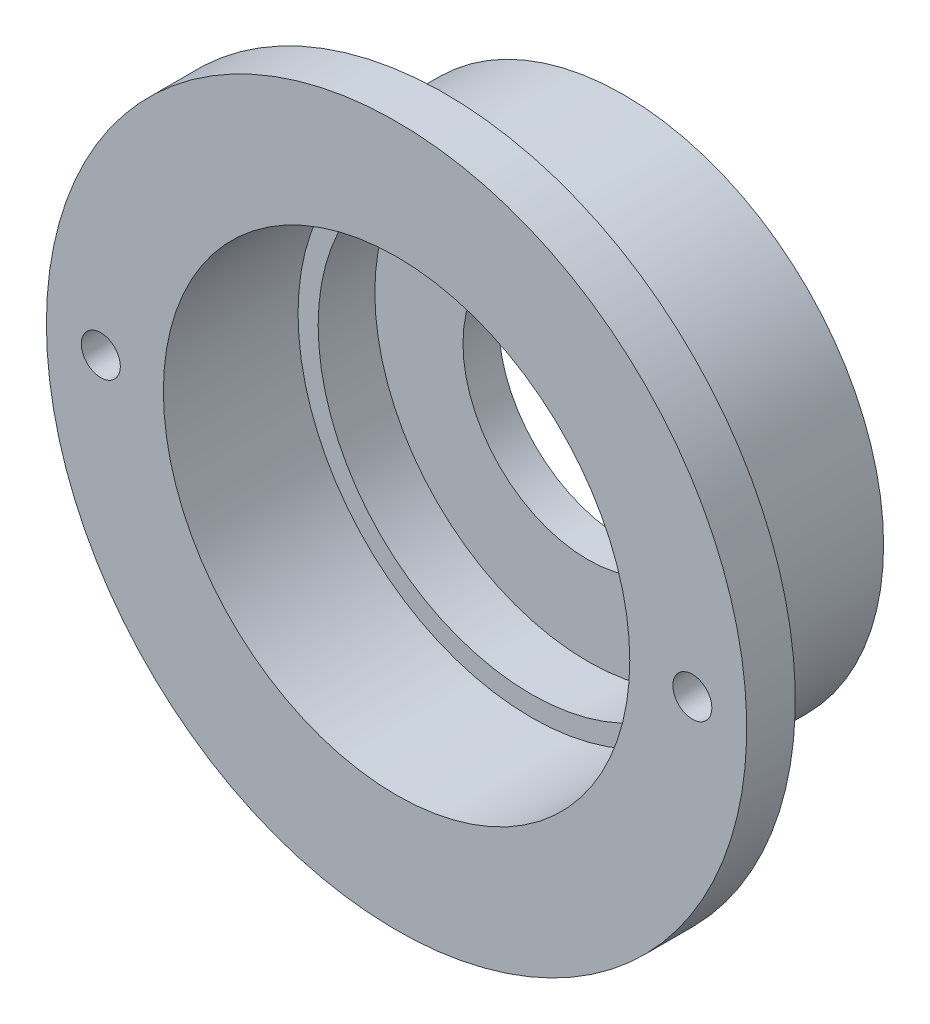
ISO-10303-21;
HEADER;
FILE_DESCRIPTION(('STEP AP214'),'2;1');
FILE_NAME('part.step','',(''),(''),'','','');
FILE_SCHEMA(('AUTOMOTIVE_DESIGN { 1 0 10303 214 1 1 1 1 }'));
ENDSEC;
DATA;
#1=APPLICATION_CONTEXT('core data for automotive mechanical design processes');
#2=APPLICATION_PROTOCOL_DEFINITION('international standard','automotive_design',2000,#1);
#3=PRODUCT_CONTEXT('',#1,'mechanical');
#4=PRODUCT('Part','Part','',(#3));
#5=PRODUCT_RELATED_PRODUCT_CATEGORY('part','',(#4));
#6=PRODUCT_DEFINITION_FORMATION('','',#4);
#7=PRODUCT_DEFINITION_CONTEXT('part definition',#1,'design');
#8=PRODUCT_DEFINITION('design','',#6,#7);
#9=PRODUCT_DEFINITION_SHAPE('','',#8);
#10=(LENGTH_UNIT() NAMED_UNIT(*) SI_UNIT(.MILLI.,.METRE.));
#11=(NAMED_UNIT(*) PLANE_ANGLE_UNIT() SI_UNIT($,.RADIAN.));
#12=(NAMED_UNIT(*) SI_UNIT($,.STERADIAN.) SOLID_ANGLE_UNIT());
#13=UNCERTAINTY_MEASURE_WITH_UNIT(LENGTH_MEASURE(1.E-05),#10,'distance_accuracy_value','');
#14=(GEOMETRIC_REPRESENTATION_CONTEXT(3) GLOBAL_UNCERTAINTY_ASSIGNED_CONTEXT((#13)) GLOBAL_UNIT_ASSIGNED_CONTEXT((#10,
#11,#12)) REPRESENTATION_CONTEXT('',''));
#15=CARTESIAN_POINT('',(0.,0.,0.));
#16=DIRECTION('',(0.,0.,1.));
#17=DIRECTION('',(1.,0.,0.));
#18=AXIS2_PLACEMENT_3D('',#15,#16,#17);
#19=CARTESIAN_POINT('',(0.,0.,-4.70047346479343));
#20=DIRECTION('',(0.,0.,-1.));
#21=DIRECTION('',(-1.,0.,0.));
#22=AXIS2_PLACEMENT_3D('',#19,#20,#21);
#23=PLANE('',#22);
#24=CARTESIAN_POINT('',(0.,0.,-4.70047346479343));
#25=DIRECTION('',(0.,0.,-1.));
#26=DIRECTION('',(-1.,0.,0.));
#27=AXIS2_PLACEMENT_3D('',#24,#25,#26);
#28=CIRCLE('',#27,7.);
#29=CARTESIAN_POINT('',(-7.,0.,-4.70047346479343));
#30=VERTEX_POINT('',#29);
#31=EDGE_CURVE('E59',#30,#30,#28,.T.);
#32=ORIENTED_EDGE('',*,*,#31,.F.);
#33=EDGE_LOOP('',(#32));
#34=FACE_BOUND('',#33,.T.);
#35=CARTESIAN_POINT('',(0.,0.,-4.70047346479343));
#36=DIRECTION('',(0.,0.,-1.));
#37=DIRECTION('',(-1.,0.,0.));
#38=AXIS2_PLACEMENT_3D('',#35,#36,#37);
#39=CIRCLE('',#38,14.565);
#40=CARTESIAN_POINT('',(-14.565,0.,-4.70047346479343));
#41=VERTEX_POINT('',#40);
#42=EDGE_CURVE('E62',#41,#41,#39,.T.);
#43=ORIENTED_EDGE('',*,*,#42,.T.);
#44=EDGE_LOOP('',(#43));
#45=FACE_BOUND('',#44,.T.);
#46=ADVANCED_FACE('F34',(#34,#45),#23,.T.);
#47=CARTESIAN_POINT('',(0.,0.,-25.4112856059014));
#48=DIRECTION('',(0.,0.,-1.));
#49=DIRECTION('',(-1.,0.,0.));
#50=AXIS2_PLACEMENT_3D('',#47,#48,#49);
#51=CYLINDRICAL_SURFACE('',#50,19.6178195017485);
#52=CARTESIAN_POINT('',(0.,0.,8.01952653520657));
#53=DIRECTION('',(0.,0.,-1.));
#54=DIRECTION('',(-1.,0.,0.));
#55=AXIS2_PLACEMENT_3D('',#52,#53,#54);
#56=CIRCLE('',#55,19.6178195017485);
#57=CARTESIAN_POINT('',(-19.6178195017485,0.,8.01952653520657));
#58=VERTEX_POINT('',#57);
#59=EDGE_CURVE('E10',#58,#58,#56,.T.);
#60=ORIENTED_EDGE('',*,*,#59,.T.);
#61=EDGE_LOOP('',(#60));
#62=FACE_BOUND('',#61,.T.);
#63=CARTESIAN_POINT('',(0.,0.,5.29952653520657));
#64=DIRECTION('',(0.,0.,-1.));
#65=DIRECTION('',(-1.,0.,0.));
#66=AXIS2_PLACEMENT_3D('',#63,#64,#65);
#67=CIRCLE('',#66,19.6178195017485);
#68=CARTESIAN_POINT('',(-19.6178195017485,0.,5.29952653520657));
#69=VERTEX_POINT('',#68);
#70=EDGE_CURVE('E37',#69,#69,#67,.F.);
#71=ORIENTED_EDGE('',*,*,#70,.T.);
#72=EDGE_LOOP('',(#71));
#73=FACE_BOUND('',#72,.T.);
#74=ADVANCED_FACE('F110',(#62,#73),#51,.T.);
#75=CARTESIAN_POINT('',(0.,0.,8.01952653520657));
#76=DIRECTION('',(0.,0.,-1.));
#77=DIRECTION('',(-1.,0.,0.));
#78=AXIS2_PLACEMENT_3D('',#75,#76,#77);
#79=PLANE('',#78);
#80=CARTESIAN_POINT('',(16.57,0.,8.01952653520657));
#81=DIRECTION('',(0.,0.,-1.));
#82=DIRECTION('',(1.,0.,0.));
#83=AXIS2_PLACEMENT_3D('',#80,#81,#82);
#84=CIRCLE('',#83,1.0922);
#85=CARTESIAN_POINT('',(17.6622,0.,8.01952653520657));
#86=VERTEX_POINT('',#85);
#87=EDGE_CURVE('E72',#86,#86,#84,.T.);
#88=ORIENTED_EDGE('',*,*,#87,.T.);
#89=EDGE_LOOP('',(#88));
#90=FACE_BOUND('',#89,.T.);
#91=CARTESIAN_POINT('',(-16.57,0.,8.01952653520657));
#92=DIRECTION('',(0.,0.,-1.));
#93=DIRECTION('',(-1.,0.,0.));
#94=AXIS2_PLACEMENT_3D('',#91,#92,#93);
#95=CIRCLE('',#94,1.0922);
#96=CARTESIAN_POINT('',(-17.6622,0.,8.01952653520657));
#97=VERTEX_POINT('',#96);
#98=EDGE_CURVE('E66',#97,#97,#95,.T.);
#99=ORIENTED_EDGE('',*,*,#98,.T.);
#100=EDGE_LOOP('',(#99));
#101=FACE_BOUND('',#100,.T.);
#102=ORIENTED_EDGE('',*,*,#59,.F.);
#103=EDGE_LOOP('',(#102));
#104=FACE_BOUND('',#103,.T.);
#105=CARTESIAN_POINT('',(0.,0.,8.01952653520657));
#106=DIRECTION('',(0.,0.,-1.));
#107=DIRECTION('',(-1.,0.,0.));
#108=AXIS2_PLACEMENT_3D('',#105,#106,#107);
#109=CIRCLE('',#108,13.0646195017485);
#110=CARTESIAN_POINT('',(-13.0646195017485,0.,8.01952653520657));
#111=VERTEX_POINT('',#110);
#112=EDGE_CURVE('E41',#111,#111,#109,.T.);
#113=ORIENTED_EDGE('',*,*,#112,.T.);
#114=EDGE_LOOP('',(#113));
#115=FACE_BOUND('',#114,.T.);
#116=ADVANCED_FACE('F81',(#90,#101,#104,#115),#79,.F.);
#117=CARTESIAN_POINT('',(0.,0.,-25.4112856059014));
#118=DIRECTION('',(0.,0.,-1.));
#119=DIRECTION('',(-1.,0.,0.));
#120=AXIS2_PLACEMENT_3D('',#117,#118,#119);
#121=CYLINDRICAL_SURFACE('',#120,13.0646195017485);
#122=ORIENTED_EDGE('',*,*,#112,.F.);
#123=EDGE_LOOP('',(#122));
#124=FACE_BOUND('',#123,.T.);
#125=CARTESIAN_POINT('',(0.,0.,0.474526535206573));
#126=DIRECTION('',(0.,0.,-1.));
#127=DIRECTION('',(-1.,0.,0.));
#128=AXIS2_PLACEMENT_3D('',#125,#126,#127);
#129=CIRCLE('',#128,13.0646195017485);
#130=CARTESIAN_POINT('',(-13.0646195017485,0.,0.474526535206573));
#131=VERTEX_POINT('',#130);
#132=EDGE_CURVE('E45',#131,#131,#129,.T.);
#133=ORIENTED_EDGE('',*,*,#132,.T.);
#134=EDGE_LOOP('',(#133));
#135=FACE_BOUND('',#134,.T.);
#136=ADVANCED_FACE('F135',(#124,#135),#121,.F.);
#137=CARTESIAN_POINT('',(0.,0.,0.474526535206571));
#138=DIRECTION('',(0.,0.,-1.));
#139=DIRECTION('',(-1.,0.,0.));
#140=AXIS2_PLACEMENT_3D('',#137,#138,#139);
#141=PLANE('',#140);
#142=ORIENTED_EDGE('',*,*,#132,.F.);
#143=EDGE_LOOP('',(#142));
#144=FACE_BOUND('',#143,.T.);
#145=CARTESIAN_POINT('',(0.,0.,0.474526535206573));
#146=DIRECTION('',(0.,0.,-1.));
#147=DIRECTION('',(-1.,0.,0.));
#148=AXIS2_PLACEMENT_3D('',#145,#146,#147);
#149=CIRCLE('',#148,11.938);
#150=CARTESIAN_POINT('',(-11.938,0.,0.474526535206573));
#151=VERTEX_POINT('',#150);
#152=EDGE_CURVE('E50',#151,#151,#149,.T.);
#153=ORIENTED_EDGE('',*,*,#152,.T.);
#154=EDGE_LOOP('',(#153));
#155=FACE_BOUND('',#154,.T.);
#156=ADVANCED_FACE('F131',(#144,#155),#141,.F.);
#157=CARTESIAN_POINT('',(0.,0.,-25.4112856059014));
#158=DIRECTION('',(0.,0.,-1.));
#159=DIRECTION('',(-1.,0.,0.));
#160=AXIS2_PLACEMENT_3D('',#157,#158,#159);
#161=CYLINDRICAL_SURFACE('',#160,11.938);
#162=ORIENTED_EDGE('',*,*,#152,.F.);
#163=EDGE_LOOP('',(#162));
#164=FACE_BOUND('',#163,.T.);
#165=CARTESIAN_POINT('',(0.,0.,-2.70047346479343));
#166=DIRECTION('',(0.,0.,-1.));
#167=DIRECTION('',(-1.,0.,0.));
#168=AXIS2_PLACEMENT_3D('',#165,#166,#167);
#169=CIRCLE('',#168,11.938);
#170=CARTESIAN_POINT('',(-11.938,0.,-2.70047346479343));
#171=VERTEX_POINT('',#170);
#172=EDGE_CURVE('E53',#171,#171,#169,.T.);
#173=ORIENTED_EDGE('',*,*,#172,.T.);
#174=EDGE_LOOP('',(#173));
#175=FACE_BOUND('',#174,.T.);
#176=ADVANCED_FACE('F124',(#164,#175),#161,.F.);
#177=CARTESIAN_POINT('',(0.,0.,-2.70047346479343));
#178=DIRECTION('',(0.,0.,-1.));
#179=DIRECTION('',(-1.,0.,0.));
#180=AXIS2_PLACEMENT_3D('',#177,#178,#179);
#181=PLANE('',#180);
#182=ORIENTED_EDGE('',*,*,#172,.F.);
#183=EDGE_LOOP('',(#182));
#184=FACE_BOUND('',#183,.T.);
#185=CARTESIAN_POINT('',(0.,0.,-2.70047346479343));
#186=DIRECTION('',(0.,0.,-1.));
#187=DIRECTION('',(-1.,0.,0.));
#188=AXIS2_PLACEMENT_3D('',#185,#186,#187);
#189=CIRCLE('',#188,7.);
#190=CARTESIAN_POINT('',(-7.,0.,-2.70047346479343));
#191=VERTEX_POINT('',#190);
#192=EDGE_CURVE('E56',#191,#191,#189,.T.);
#193=ORIENTED_EDGE('',*,*,#192,.T.);
#194=EDGE_LOOP('',(#193));
#195=FACE_BOUND('',#194,.T.);
#196=ADVANCED_FACE('F118',(#184,#195),#181,.F.);
#197=CARTESIAN_POINT('',(0.,0.,-25.4112856059014));
#198=DIRECTION('',(0.,0.,-1.));
#199=DIRECTION('',(-1.,0.,0.));
#200=AXIS2_PLACEMENT_3D('',#197,#198,#199);
#201=CYLINDRICAL_SURFACE('',#200,7.);
#202=ORIENTED_EDGE('',*,*,#192,.F.);
#203=EDGE_LOOP('',(#202));
#204=FACE_BOUND('',#203,.T.);
#205=ORIENTED_EDGE('',*,*,#31,.T.);
#206=EDGE_LOOP('',(#205));
#207=FACE_BOUND('',#206,.T.);
#208=ADVANCED_FACE('F95',(#204,#207),#201,.F.);
#209=CARTESIAN_POINT('',(0.,0.,5.29952653520657));
#210=DIRECTION('',(0.,0.,-1.));
#211=DIRECTION('',(-1.,0.,0.));
#212=AXIS2_PLACEMENT_3D('',#209,#210,#211);
#213=PLANE('',#212);
#214=CARTESIAN_POINT('',(16.57,0.,5.29952653520657));
#215=DIRECTION('',(0.,0.,-1.));
#216=DIRECTION('',(1.,0.,0.));
#217=AXIS2_PLACEMENT_3D('',#214,#215,#216);
#218=CIRCLE('',#217,1.0922);
#219=CARTESIAN_POINT('',(17.6622,0.,5.29952653520657));
#220=VERTEX_POINT('',#219);
#221=EDGE_CURVE('E75',#220,#220,#218,.T.);
#222=ORIENTED_EDGE('',*,*,#221,.F.);
#223=EDGE_LOOP('',(#222));
#224=FACE_BOUND('',#223,.T.);
#225=CARTESIAN_POINT('',(-16.57,0.,5.29952653520657));
#226=DIRECTION('',(0.,0.,-1.));
#227=DIRECTION('',(-1.,0.,0.));
#228=AXIS2_PLACEMENT_3D('',#225,#226,#227);
#229=CIRCLE('',#228,1.0922);
#230=CARTESIAN_POINT('',(-17.6622,0.,5.29952653520657));
#231=VERTEX_POINT('',#230);
#232=EDGE_CURVE('E69',#231,#231,#229,.T.);
#233=ORIENTED_EDGE('',*,*,#232,.F.);
#234=EDGE_LOOP('',(#233));
#235=FACE_BOUND('',#234,.T.);
#236=ORIENTED_EDGE('',*,*,#70,.F.);
#237=EDGE_LOOP('',(#236));
#238=FACE_BOUND('',#237,.T.);
#239=CARTESIAN_POINT('',(0.,0.,5.29952653520657));
#240=DIRECTION('',(0.,0.,-1.));
#241=DIRECTION('',(-1.,0.,0.));
#242=AXIS2_PLACEMENT_3D('',#239,#240,#241);
#243=CIRCLE('',#242,14.565);
#244=CARTESIAN_POINT('',(-14.565,0.,5.29952653520657));
#245=VERTEX_POINT('',#244);
#246=EDGE_CURVE('E65',#245,#245,#243,.T.);
#247=ORIENTED_EDGE('',*,*,#246,.F.);
#248=EDGE_LOOP('',(#247));
#249=FACE_BOUND('',#248,.T.);
#250=ADVANCED_FACE('F91',(#224,#235,#238,#249),#213,.T.);
#251=CARTESIAN_POINT('',(0.,0.,5.29952653520657));
#252=DIRECTION('',(0.,0.,-1.));
#253=DIRECTION('',(-1.,0.,0.));
#254=AXIS2_PLACEMENT_3D('',#251,#252,#253);
#255=CYLINDRICAL_SURFACE('',#254,14.565);
#256=ORIENTED_EDGE('',*,*,#246,.T.);
#257=EDGE_LOOP('',(#256));
#258=FACE_BOUND('',#257,.T.);
#259=ORIENTED_EDGE('',*,*,#42,.F.);
#260=EDGE_LOOP('',(#259));
#261=FACE_BOUND('',#260,.T.);
#262=ADVANCED_FACE('F94',(#258,#261),#255,.T.);
#263=CARTESIAN_POINT('',(-16.57,0.,8.01952653520657));
#264=DIRECTION('',(0.,0.,-1.));
#265=DIRECTION('',(-1.,0.,0.));
#266=AXIS2_PLACEMENT_3D('',#263,#264,#265);
#267=CYLINDRICAL_SURFACE('',#266,1.0922);
#268=ORIENTED_EDGE('',*,*,#98,.F.);
#269=EDGE_LOOP('',(#268));
#270=FACE_BOUND('',#269,.T.);
#271=ORIENTED_EDGE('',*,*,#232,.T.);
#272=EDGE_LOOP('',(#271));
#273=FACE_BOUND('',#272,.T.);
#274=ADVANCED_FACE('F87',(#270,#273),#267,.F.);
#275=CARTESIAN_POINT('',(16.57,0.,8.01952653520657));
#276=DIRECTION('',(0.,0.,-1.));
#277=DIRECTION('',(-1.,0.,0.));
#278=AXIS2_PLACEMENT_3D('',#275,#276,#277);
#279=CYLINDRICAL_SURFACE('',#278,1.0922);
#280=ORIENTED_EDGE('',*,*,#87,.F.);
#281=EDGE_LOOP('',(#280));
#282=FACE_BOUND('',#281,.T.);
#283=ORIENTED_EDGE('',*,*,#221,.T.);
#284=EDGE_LOOP('',(#283));
#285=FACE_BOUND('',#284,.T.);
#286=ADVANCED_FACE('F84',(#282,#285),#279,.F.);
#287=CLOSED_SHELL('',(#46,#74,#116,#136,#156,#176,#196,#208,#250,#262,#274,#286));
#288=MANIFOLD_SOLID_BREP('B2',#287);
#289=ADVANCED_BREP_SHAPE_REPRESENTATION('',(#18,#288),#14);
#290=SHAPE_DEFINITION_REPRESENTATION(#9,#289);
ENDSEC;
END-ISO-10303-21;
